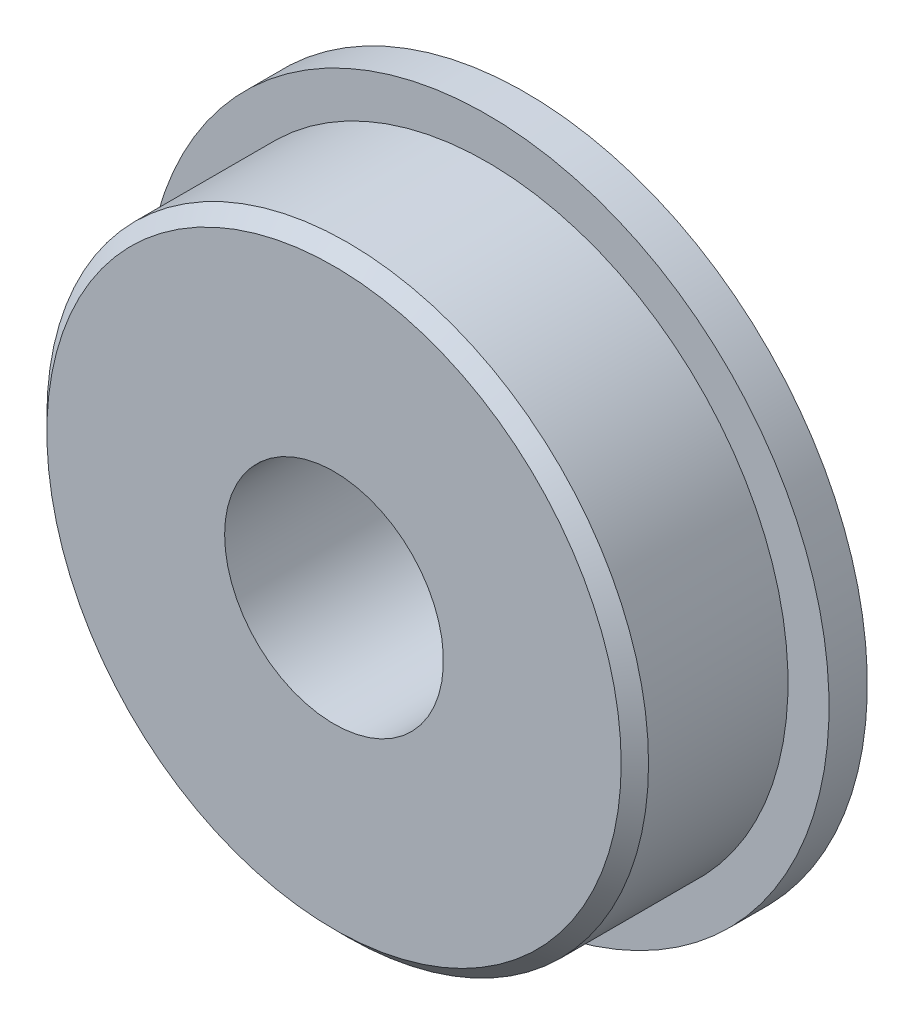
ISO-10303-21;
HEADER;
FILE_DESCRIPTION(('STEP AP214'),'2;1');
FILE_NAME('part.step','',(''),(''),'','','');
FILE_SCHEMA(('AUTOMOTIVE_DESIGN { 1 0 10303 214 1 1 1 1 }'));
ENDSEC;
DATA;
#1=APPLICATION_CONTEXT('core data for automotive mechanical design processes');
#2=APPLICATION_PROTOCOL_DEFINITION('international standard','automotive_design',2000,#1);
#3=PRODUCT_CONTEXT('',#1,'mechanical');
#4=PRODUCT('Part','Part','',(#3));
#5=PRODUCT_RELATED_PRODUCT_CATEGORY('part','',(#4));
#6=PRODUCT_DEFINITION_FORMATION('','',#4);
#7=PRODUCT_DEFINITION_CONTEXT('part definition',#1,'design');
#8=PRODUCT_DEFINITION('design','',#6,#7);
#9=PRODUCT_DEFINITION_SHAPE('','',#8);
#10=(LENGTH_UNIT() NAMED_UNIT(*) SI_UNIT(.MILLI.,.METRE.));
#11=(NAMED_UNIT(*) PLANE_ANGLE_UNIT() SI_UNIT($,.RADIAN.));
#12=(NAMED_UNIT(*) SI_UNIT($,.STERADIAN.) SOLID_ANGLE_UNIT());
#13=UNCERTAINTY_MEASURE_WITH_UNIT(LENGTH_MEASURE(1.E-05),#10,'distance_accuracy_value','');
#14=(GEOMETRIC_REPRESENTATION_CONTEXT(3) GLOBAL_UNCERTAINTY_ASSIGNED_CONTEXT((#13)) GLOBAL_UNIT_ASSIGNED_CONTEXT((#10,
#11,#12)) REPRESENTATION_CONTEXT('',''));
#15=CARTESIAN_POINT('',(0.,0.,0.));
#16=DIRECTION('',(0.,0.,1.));
#17=DIRECTION('',(1.,0.,0.));
#18=AXIS2_PLACEMENT_3D('',#15,#16,#17);
#19=CARTESIAN_POINT('',(-4.,0.,0.));
#20=DIRECTION('',(0.,0.,-1.));
#21=DIRECTION('',(-1.,0.,0.));
#22=AXIS2_PLACEMENT_3D('',#19,#20,#21);
#23=PLANE('',#22);
#24=CARTESIAN_POINT('',(0.,0.,0.));
#25=DIRECTION('',(0.,0.,-1.));
#26=DIRECTION('',(-1.,0.,0.));
#27=AXIS2_PLACEMENT_3D('',#24,#25,#26);
#28=CIRCLE('',#27,12.5);
#29=CARTESIAN_POINT('',(-12.5,0.,0.));
#30=VERTEX_POINT('',#29);
#31=EDGE_CURVE('E46',#30,#30,#28,.T.);
#32=ORIENTED_EDGE('',*,*,#31,.T.);
#33=EDGE_LOOP('',(#32));
#34=FACE_BOUND('',#33,.T.);
#35=CARTESIAN_POINT('',(0.,0.,0.));
#36=DIRECTION('',(0.,0.,-1.));
#37=DIRECTION('',(-1.,0.,0.));
#38=AXIS2_PLACEMENT_3D('',#35,#36,#37);
#39=CIRCLE('',#38,4.);
#40=CARTESIAN_POINT('',(-4.,0.,0.));
#41=VERTEX_POINT('',#40);
#42=EDGE_CURVE('E61',#41,#41,#39,.T.);
#43=ORIENTED_EDGE('',*,*,#42,.F.);
#44=EDGE_LOOP('',(#43));
#45=FACE_BOUND('',#44,.T.);
#46=ADVANCED_FACE('F35',(#34,#45),#23,.T.);
#47=CARTESIAN_POINT('',(0.,0.,-20.1785714285714));
#48=DIRECTION('',(0.,0.,-1.));
#49=DIRECTION('',(-1.,0.,0.));
#50=AXIS2_PLACEMENT_3D('',#47,#48,#49);
#51=CYLINDRICAL_SURFACE('',#50,12.5);
#52=CARTESIAN_POINT('',(0.,0.,1.4));
#53=DIRECTION('',(0.,0.,-1.));
#54=DIRECTION('',(-1.,0.,0.));
#55=AXIS2_PLACEMENT_3D('',#52,#53,#54);
#56=CIRCLE('',#55,12.5);
#57=CARTESIAN_POINT('',(-12.5,0.,1.4));
#58=VERTEX_POINT('',#57);
#59=EDGE_CURVE('E50',#58,#58,#56,.T.);
#60=ORIENTED_EDGE('',*,*,#59,.T.);
#61=EDGE_LOOP('',(#60));
#62=FACE_BOUND('',#61,.T.);
#63=ORIENTED_EDGE('',*,*,#31,.F.);
#64=EDGE_LOOP('',(#63));
#65=FACE_BOUND('',#64,.T.);
#66=ADVANCED_FACE('F69',(#62,#65),#51,.T.);
#67=CARTESIAN_POINT('',(-12.5,0.,1.4));
#68=DIRECTION('',(0.,0.,1.));
#69=DIRECTION('',(1.,0.,0.));
#70=AXIS2_PLACEMENT_3D('',#67,#68,#69);
#71=PLANE('',#70);
#72=CARTESIAN_POINT('',(0.,0.,1.4));
#73=DIRECTION('',(0.,0.,-1.));
#74=DIRECTION('',(-1.,0.,0.));
#75=AXIS2_PLACEMENT_3D('',#72,#73,#74);
#76=CIRCLE('',#75,11.);
#77=CARTESIAN_POINT('',(-11.,0.,1.4));
#78=VERTEX_POINT('',#77);
#79=EDGE_CURVE('E55',#78,#78,#76,.T.);
#80=ORIENTED_EDGE('',*,*,#79,.T.);
#81=EDGE_LOOP('',(#80));
#82=FACE_BOUND('',#81,.T.);
#83=ORIENTED_EDGE('',*,*,#59,.F.);
#84=EDGE_LOOP('',(#83));
#85=FACE_BOUND('',#84,.T.);
#86=ADVANCED_FACE('F74',(#82,#85),#71,.T.);
#87=CARTESIAN_POINT('',(0.,0.,-20.1785714285714));
#88=DIRECTION('',(0.,0.,-1.));
#89=DIRECTION('',(-1.,0.,0.));
#90=AXIS2_PLACEMENT_3D('',#87,#88,#89);
#91=CYLINDRICAL_SURFACE('',#90,11.);
#92=CARTESIAN_POINT('',(0.,0.,6.50000000000001));
#93=DIRECTION('',(0.,0.,1.));
#94=DIRECTION('',(1.,0.,0.));
#95=AXIS2_PLACEMENT_3D('',#92,#93,#94);
#96=CIRCLE('',#95,11.);
#97=CARTESIAN_POINT('',(11.,0.,6.50000000000001));
#98=VERTEX_POINT('',#97);
#99=EDGE_CURVE('E42',#98,#98,#96,.F.);
#100=ORIENTED_EDGE('',*,*,#99,.T.);
#101=EDGE_LOOP('',(#100));
#102=FACE_BOUND('',#101,.T.);
#103=ORIENTED_EDGE('',*,*,#79,.F.);
#104=EDGE_LOOP('',(#103));
#105=FACE_BOUND('',#104,.T.);
#106=ADVANCED_FACE('F80',(#102,#105),#91,.T.);
#107=CARTESIAN_POINT('',(-11.,0.,7.));
#108=DIRECTION('',(0.,0.,1.));
#109=DIRECTION('',(1.,0.,0.));
#110=AXIS2_PLACEMENT_3D('',#107,#108,#109);
#111=PLANE('',#110);
#112=CARTESIAN_POINT('',(0.,0.,7.));
#113=DIRECTION('',(0.,0.,1.));
#114=DIRECTION('',(1.,0.,0.));
#115=AXIS2_PLACEMENT_3D('',#112,#113,#114);
#116=CIRCLE('',#115,10.5);
#117=CARTESIAN_POINT('',(10.5,0.,7.));
#118=VERTEX_POINT('',#117);
#119=EDGE_CURVE('E10',#118,#118,#116,.T.);
#120=ORIENTED_EDGE('',*,*,#119,.T.);
#121=EDGE_LOOP('',(#120));
#122=FACE_BOUND('',#121,.T.);
#123=CARTESIAN_POINT('',(0.,0.,7.));
#124=DIRECTION('',(0.,0.,-1.));
#125=DIRECTION('',(-1.,0.,0.));
#126=AXIS2_PLACEMENT_3D('',#123,#124,#125);
#127=CIRCLE('',#126,4.);
#128=CARTESIAN_POINT('',(-4.,0.,7.));
#129=VERTEX_POINT('',#128);
#130=EDGE_CURVE('E58',#129,#129,#127,.T.);
#131=ORIENTED_EDGE('',*,*,#130,.T.);
#132=EDGE_LOOP('',(#131));
#133=FACE_BOUND('',#132,.T.);
#134=ADVANCED_FACE('F84',(#122,#133),#111,.T.);
#135=CARTESIAN_POINT('',(0.,0.,-20.1785714285714));
#136=DIRECTION('',(0.,0.,-1.));
#137=DIRECTION('',(-1.,0.,0.));
#138=AXIS2_PLACEMENT_3D('',#135,#136,#137);
#139=CYLINDRICAL_SURFACE('',#138,4.);
#140=ORIENTED_EDGE('',*,*,#42,.T.);
#141=EDGE_LOOP('',(#140));
#142=FACE_BOUND('',#141,.T.);
#143=ORIENTED_EDGE('',*,*,#130,.F.);
#144=EDGE_LOOP('',(#143));
#145=FACE_BOUND('',#144,.T.);
#146=ADVANCED_FACE('F65',(#142,#145),#139,.F.);
#147=CARTESIAN_POINT('',(0.,0.,6.50000000000001));
#148=DIRECTION('',(0.,0.,-1.));
#149=DIRECTION('',(-1.,0.,0.));
#150=AXIS2_PLACEMENT_3D('',#147,#148,#149);
#151=CONICAL_SURFACE('',#150,11.,0.785398163397448);
#152=ORIENTED_EDGE('',*,*,#119,.F.);
#153=EDGE_LOOP('',(#152));
#154=FACE_BOUND('',#153,.T.);
#155=ORIENTED_EDGE('',*,*,#99,.F.);
#156=EDGE_LOOP('',(#155));
#157=FACE_BOUND('',#156,.T.);
#158=ADVANCED_FACE('F37',(#154,#157),#151,.T.);
#159=CLOSED_SHELL('',(#46,#66,#86,#106,#134,#146,#158));
#160=MANIFOLD_SOLID_BREP('B2',#159);
#161=ADVANCED_BREP_SHAPE_REPRESENTATION('',(#18,#160),#14);
#162=SHAPE_DEFINITION_REPRESENTATION(#9,#161);
ENDSEC;
END-ISO-10303-21;
